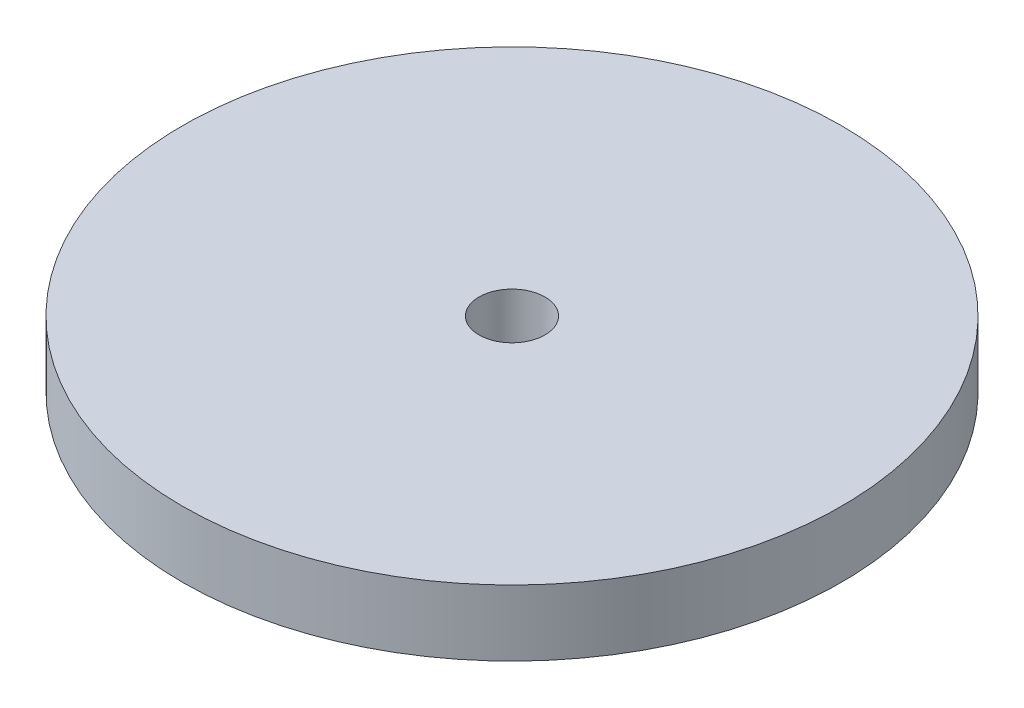
ISO-10303-21;
HEADER;
FILE_DESCRIPTION(('STEP AP214'),'2;1');
FILE_NAME('part.step','',(''),(''),'','','');
FILE_SCHEMA(('AUTOMOTIVE_DESIGN { 1 0 10303 214 1 1 1 1 }'));
ENDSEC;
DATA;
#1=APPLICATION_CONTEXT('core data for automotive mechanical design processes');
#2=APPLICATION_PROTOCOL_DEFINITION('international standard','automotive_design',2000,#1);
#3=PRODUCT_CONTEXT('',#1,'mechanical');
#4=PRODUCT('Part','Part','',(#3));
#5=PRODUCT_RELATED_PRODUCT_CATEGORY('part','',(#4));
#6=PRODUCT_DEFINITION_FORMATION('','',#4);
#7=PRODUCT_DEFINITION_CONTEXT('part definition',#1,'design');
#8=PRODUCT_DEFINITION('design','',#6,#7);
#9=PRODUCT_DEFINITION_SHAPE('','',#8);
#10=(LENGTH_UNIT() NAMED_UNIT(*) SI_UNIT(.MILLI.,.METRE.));
#11=(NAMED_UNIT(*) PLANE_ANGLE_UNIT() SI_UNIT($,.RADIAN.));
#12=(NAMED_UNIT(*) SI_UNIT($,.STERADIAN.) SOLID_ANGLE_UNIT());
#13=UNCERTAINTY_MEASURE_WITH_UNIT(LENGTH_MEASURE(1.E-05),#10,'distance_accuracy_value','');
#14=(GEOMETRIC_REPRESENTATION_CONTEXT(3) GLOBAL_UNCERTAINTY_ASSIGNED_CONTEXT((#13)) GLOBAL_UNIT_ASSIGNED_CONTEXT((#10,
#11,#12)) REPRESENTATION_CONTEXT('',''));
#15=CARTESIAN_POINT('',(0.,0.,0.));
#16=DIRECTION('',(0.,0.,1.));
#17=DIRECTION('',(1.,0.,0.));
#18=AXIS2_PLACEMENT_3D('',#15,#16,#17);
#19=CARTESIAN_POINT('',(0.,4.,0.));
#20=DIRECTION('',(0.,-1.,0.));
#21=DIRECTION('',(0.,0.,-1.));
#22=AXIS2_PLACEMENT_3D('',#19,#20,#21);
#23=CYLINDRICAL_SURFACE('',#22,20.);
#24=CARTESIAN_POINT('',(0.,4.,0.));
#25=DIRECTION('',(0.,1.,0.));
#26=DIRECTION('',(0.,0.,1.));
#27=AXIS2_PLACEMENT_3D('',#24,#25,#26);
#28=CIRCLE('',#27,20.);
#29=CARTESIAN_POINT('',(0.,4.,20.));
#30=VERTEX_POINT('',#29);
#31=EDGE_CURVE('E10',#30,#30,#28,.T.);
#32=ORIENTED_EDGE('',*,*,#31,.F.);
#33=EDGE_LOOP('',(#32));
#34=FACE_BOUND('',#33,.T.);
#35=CARTESIAN_POINT('',(0.,0.,0.));
#36=DIRECTION('',(0.,1.,0.));
#37=DIRECTION('',(0.,0.,1.));
#38=AXIS2_PLACEMENT_3D('',#35,#36,#37);
#39=CIRCLE('',#38,20.);
#40=CARTESIAN_POINT('',(0.,0.,20.));
#41=VERTEX_POINT('',#40);
#42=EDGE_CURVE('E41',#41,#41,#39,.T.);
#43=ORIENTED_EDGE('',*,*,#42,.T.);
#44=EDGE_LOOP('',(#43));
#45=FACE_BOUND('',#44,.T.);
#46=ADVANCED_FACE('F34',(#34,#45),#23,.T.);
#47=CARTESIAN_POINT('',(0.,4.,0.));
#48=DIRECTION('',(0.,1.,0.));
#49=DIRECTION('',(0.,0.,1.));
#50=AXIS2_PLACEMENT_3D('',#47,#48,#49);
#51=PLANE('',#50);
#52=CARTESIAN_POINT('',(0.,4.,0.));
#53=DIRECTION('',(0.,-1.,0.));
#54=DIRECTION('',(0.,0.,-1.));
#55=AXIS2_PLACEMENT_3D('',#52,#53,#54);
#56=CIRCLE('',#55,2.);
#57=CARTESIAN_POINT('',(0.,4.,-2.));
#58=VERTEX_POINT('',#57);
#59=EDGE_CURVE('E47',#58,#58,#56,.T.);
#60=ORIENTED_EDGE('',*,*,#59,.T.);
#61=EDGE_LOOP('',(#60));
#62=FACE_BOUND('',#61,.T.);
#63=ORIENTED_EDGE('',*,*,#31,.T.);
#64=EDGE_LOOP('',(#63));
#65=FACE_BOUND('',#64,.T.);
#66=ADVANCED_FACE('F64',(#62,#65),#51,.T.);
#67=CARTESIAN_POINT('',(0.,0.,0.));
#68=DIRECTION('',(0.,1.,0.));
#69=DIRECTION('',(0.,0.,1.));
#70=AXIS2_PLACEMENT_3D('',#67,#68,#69);
#71=PLANE('',#70);
#72=CARTESIAN_POINT('',(0.,0.,0.));
#73=DIRECTION('',(0.,1.,0.));
#74=DIRECTION('',(0.,0.,1.));
#75=AXIS2_PLACEMENT_3D('',#72,#73,#74);
#76=CIRCLE('',#75,2.);
#77=CARTESIAN_POINT('',(0.,0.,2.));
#78=VERTEX_POINT('',#77);
#79=EDGE_CURVE('E37',#78,#78,#76,.T.);
#80=ORIENTED_EDGE('',*,*,#79,.T.);
#81=EDGE_LOOP('',(#80));
#82=FACE_BOUND('',#81,.T.);
#83=ORIENTED_EDGE('',*,*,#42,.F.);
#84=EDGE_LOOP('',(#83));
#85=FACE_BOUND('',#84,.T.);
#86=ADVANCED_FACE('F54',(#82,#85),#71,.F.);
#87=CARTESIAN_POINT('',(0.,4.,0.));
#88=DIRECTION('',(0.,-1.,0.));
#89=DIRECTION('',(0.,0.,-1.));
#90=AXIS2_PLACEMENT_3D('',#87,#88,#89);
#91=CYLINDRICAL_SURFACE('',#90,2.);
#92=ORIENTED_EDGE('',*,*,#59,.F.);
#93=EDGE_LOOP('',(#92));
#94=FACE_BOUND('',#93,.T.);
#95=ORIENTED_EDGE('',*,*,#79,.F.);
#96=EDGE_LOOP('',(#95));
#97=FACE_BOUND('',#96,.T.);
#98=ADVANCED_FACE('F57',(#94,#97),#91,.F.);
#99=CLOSED_SHELL('',(#46,#66,#86,#98));
#100=MANIFOLD_SOLID_BREP('B2',#99);
#101=ADVANCED_BREP_SHAPE_REPRESENTATION('',(#18,#100),#14);
#102=SHAPE_DEFINITION_REPRESENTATION(#9,#101);
ENDSEC;
END-ISO-10303-21;
